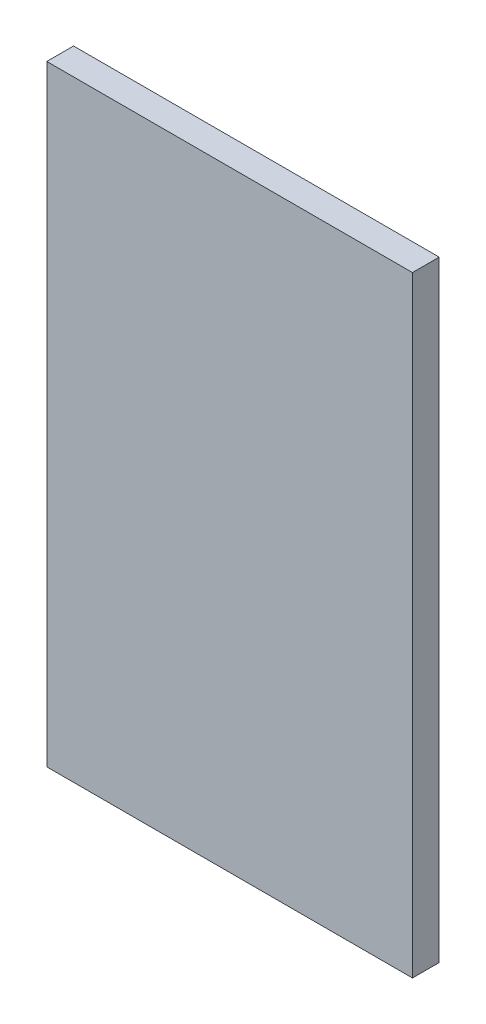
ISO-10303-21;
HEADER;
FILE_DESCRIPTION(('STEP AP214'),'2;1');
FILE_NAME('part.step','',(''),(''),'','','');
FILE_SCHEMA(('AUTOMOTIVE_DESIGN { 1 0 10303 214 1 1 1 1 }'));
ENDSEC;
DATA;
#1=APPLICATION_CONTEXT('core data for automotive mechanical design processes');
#2=APPLICATION_PROTOCOL_DEFINITION('international standard','automotive_design',2000,#1);
#3=PRODUCT_CONTEXT('',#1,'mechanical');
#4=PRODUCT('Part','Part','',(#3));
#5=PRODUCT_RELATED_PRODUCT_CATEGORY('part','',(#4));
#6=PRODUCT_DEFINITION_FORMATION('','',#4);
#7=PRODUCT_DEFINITION_CONTEXT('part definition',#1,'design');
#8=PRODUCT_DEFINITION('design','',#6,#7);
#9=PRODUCT_DEFINITION_SHAPE('','',#8);
#10=(LENGTH_UNIT() NAMED_UNIT(*) SI_UNIT(.MILLI.,.METRE.));
#11=(NAMED_UNIT(*) PLANE_ANGLE_UNIT() SI_UNIT($,.RADIAN.));
#12=(NAMED_UNIT(*) SI_UNIT($,.STERADIAN.) SOLID_ANGLE_UNIT());
#13=UNCERTAINTY_MEASURE_WITH_UNIT(LENGTH_MEASURE(1.E-05),#10,'distance_accuracy_value','');
#14=(GEOMETRIC_REPRESENTATION_CONTEXT(3) GLOBAL_UNCERTAINTY_ASSIGNED_CONTEXT((#13)) GLOBAL_UNIT_ASSIGNED_CONTEXT((#10,
#11,#12)) REPRESENTATION_CONTEXT('',''));
#15=CARTESIAN_POINT('',(0.,0.,0.));
#16=DIRECTION('',(0.,0.,1.));
#17=DIRECTION('',(1.,0.,0.));
#18=AXIS2_PLACEMENT_3D('',#15,#16,#17);
#19=CARTESIAN_POINT('',(583.,204.,12.));
#20=DIRECTION('',(-1.,0.,0.));
#21=DIRECTION('',(0.,0.,1.));
#22=AXIS2_PLACEMENT_3D('',#19,#20,#21);
#23=PLANE('',#22);
#24=DIRECTION('',(0.,1.,0.));
#25=VECTOR('',#24,1.);
#26=CARTESIAN_POINT('',(583.,204.,0.));
#27=LINE('',#26,#25);
#28=CARTESIAN_POINT('',(583.,-70.,0.));
#29=VERTEX_POINT('',#28);
#30=CARTESIAN_POINT('',(583.,204.,0.));
#31=VERTEX_POINT('',#30);
#32=EDGE_CURVE('E95',#29,#31,#27,.T.);
#33=ORIENTED_EDGE('',*,*,#32,.T.);
#34=DIRECTION('',(0.,0.,-1.));
#35=VECTOR('',#34,1.);
#36=CARTESIAN_POINT('',(583.,204.,12.));
#37=LINE('',#36,#35);
#38=CARTESIAN_POINT('',(583.,204.,12.));
#39=VERTEX_POINT('',#38);
#40=EDGE_CURVE('E11',#39,#31,#37,.T.);
#41=ORIENTED_EDGE('',*,*,#40,.F.);
#42=DIRECTION('',(0.,1.,0.));
#43=VECTOR('',#42,1.);
#44=CARTESIAN_POINT('',(583.,204.,12.));
#45=LINE('',#44,#43);
#46=CARTESIAN_POINT('',(583.,-70.,12.));
#47=VERTEX_POINT('',#46);
#48=EDGE_CURVE('E83',#47,#39,#45,.T.);
#49=ORIENTED_EDGE('',*,*,#48,.F.);
#50=DIRECTION('',(0.,0.,-1.));
#51=VECTOR('',#50,1.);
#52=CARTESIAN_POINT('',(583.,-70.,12.));
#53=LINE('',#52,#51);
#54=EDGE_CURVE('E91',#47,#29,#53,.T.);
#55=ORIENTED_EDGE('',*,*,#54,.T.);
#56=EDGE_LOOP('',(#33,#41,#49,#55));
#57=FACE_BOUND('',#56,.T.);
#58=ADVANCED_FACE('F32',(#57),#23,.F.);
#59=CARTESIAN_POINT('',(419.,204.,12.));
#60=DIRECTION('',(0.,-1.,0.));
#61=DIRECTION('',(0.,0.,-1.));
#62=AXIS2_PLACEMENT_3D('',#59,#60,#61);
#63=PLANE('',#62);
#64=DIRECTION('',(-1.,0.,0.));
#65=VECTOR('',#64,1.);
#66=CARTESIAN_POINT('',(419.,204.,0.));
#67=LINE('',#66,#65);
#68=CARTESIAN_POINT('',(419.,204.,0.));
#69=VERTEX_POINT('',#68);
#70=EDGE_CURVE('E87',#31,#69,#67,.T.);
#71=ORIENTED_EDGE('',*,*,#70,.T.);
#72=DIRECTION('',(0.,0.,-1.));
#73=VECTOR('',#72,1.);
#74=CARTESIAN_POINT('',(419.,204.,12.));
#75=LINE('',#74,#73);
#76=CARTESIAN_POINT('',(419.,204.,12.));
#77=VERTEX_POINT('',#76);
#78=EDGE_CURVE('E40',#77,#69,#75,.T.);
#79=ORIENTED_EDGE('',*,*,#78,.F.);
#80=DIRECTION('',(-1.,0.,0.));
#81=VECTOR('',#80,1.);
#82=CARTESIAN_POINT('',(419.,204.,12.));
#83=LINE('',#82,#81);
#84=EDGE_CURVE('E78',#39,#77,#83,.T.);
#85=ORIENTED_EDGE('',*,*,#84,.F.);
#86=ORIENTED_EDGE('',*,*,#40,.T.);
#87=EDGE_LOOP('',(#71,#79,#85,#86));
#88=FACE_BOUND('',#87,.T.);
#89=ADVANCED_FACE('F86',(#88),#63,.F.);
#90=CARTESIAN_POINT('',(419.,204.,12.));
#91=DIRECTION('',(1.,0.,0.));
#92=DIRECTION('',(0.,1.,0.));
#93=AXIS2_PLACEMENT_3D('',#90,#91,#92);
#94=PLANE('',#93);
#95=DIRECTION('',(0.,-1.,0.));
#96=VECTOR('',#95,1.);
#97=CARTESIAN_POINT('',(419.,204.,0.));
#98=LINE('',#97,#96);
#99=CARTESIAN_POINT('',(419.,-70.,0.));
#100=VERTEX_POINT('',#99);
#101=EDGE_CURVE('E65',#69,#100,#98,.T.);
#102=ORIENTED_EDGE('',*,*,#101,.T.);
#103=DIRECTION('',(0.,0.,-1.));
#104=VECTOR('',#103,1.);
#105=CARTESIAN_POINT('',(419.,-70.,12.));
#106=LINE('',#105,#104);
#107=CARTESIAN_POINT('',(419.,-70.,12.));
#108=VERTEX_POINT('',#107);
#109=EDGE_CURVE('E88',#108,#100,#106,.T.);
#110=ORIENTED_EDGE('',*,*,#109,.F.);
#111=DIRECTION('',(0.,-1.,0.));
#112=VECTOR('',#111,1.);
#113=CARTESIAN_POINT('',(419.,204.,12.));
#114=LINE('',#113,#112);
#115=EDGE_CURVE('E81',#77,#108,#114,.T.);
#116=ORIENTED_EDGE('',*,*,#115,.F.);
#117=ORIENTED_EDGE('',*,*,#78,.T.);
#118=EDGE_LOOP('',(#102,#110,#116,#117));
#119=FACE_BOUND('',#118,.T.);
#120=ADVANCED_FACE('F89',(#119),#94,.F.);
#121=CARTESIAN_POINT('',(419.,-70.,12.));
#122=DIRECTION('',(0.,1.,0.));
#123=DIRECTION('',(0.,0.,1.));
#124=AXIS2_PLACEMENT_3D('',#121,#122,#123);
#125=PLANE('',#124);
#126=DIRECTION('',(1.,0.,0.));
#127=VECTOR('',#126,1.);
#128=CARTESIAN_POINT('',(419.,-70.,0.));
#129=LINE('',#128,#127);
#130=EDGE_CURVE('E71',#100,#29,#129,.T.);
#131=ORIENTED_EDGE('',*,*,#130,.T.);
#132=ORIENTED_EDGE('',*,*,#54,.F.);
#133=DIRECTION('',(1.,0.,0.));
#134=VECTOR('',#133,1.);
#135=CARTESIAN_POINT('',(419.,-70.,12.));
#136=LINE('',#135,#134);
#137=EDGE_CURVE('E48',#108,#47,#136,.T.);
#138=ORIENTED_EDGE('',*,*,#137,.F.);
#139=ORIENTED_EDGE('',*,*,#109,.T.);
#140=EDGE_LOOP('',(#131,#132,#138,#139));
#141=FACE_BOUND('',#140,.T.);
#142=ADVANCED_FACE('F102',(#141),#125,.F.);
#143=CARTESIAN_POINT('',(0.,0.,12.));
#144=DIRECTION('',(0.,0.,1.));
#145=DIRECTION('',(1.,0.,0.));
#146=AXIS2_PLACEMENT_3D('',#143,#144,#145);
#147=PLANE('',#146);
#148=ORIENTED_EDGE('',*,*,#48,.T.);
#149=ORIENTED_EDGE('',*,*,#84,.T.);
#150=ORIENTED_EDGE('',*,*,#115,.T.);
#151=ORIENTED_EDGE('',*,*,#137,.T.);
#152=EDGE_LOOP('',(#148,#149,#150,#151));
#153=FACE_BOUND('',#152,.T.);
#154=ADVANCED_FACE('F79',(#153),#147,.T.);
#155=CARTESIAN_POINT('',(0.,0.,0.));
#156=DIRECTION('',(0.,0.,1.));
#157=DIRECTION('',(1.,0.,0.));
#158=AXIS2_PLACEMENT_3D('',#155,#156,#157);
#159=PLANE('',#158);
#160=ORIENTED_EDGE('',*,*,#32,.F.);
#161=ORIENTED_EDGE('',*,*,#130,.F.);
#162=ORIENTED_EDGE('',*,*,#101,.F.);
#163=ORIENTED_EDGE('',*,*,#70,.F.);
#164=EDGE_LOOP('',(#160,#161,#162,#163));
#165=FACE_BOUND('',#164,.T.);
#166=ADVANCED_FACE('F105',(#165),#159,.F.);
#167=CLOSED_SHELL('',(#58,#89,#120,#142,#154,#166));
#168=MANIFOLD_SOLID_BREP('B2',#167);
#169=ADVANCED_BREP_SHAPE_REPRESENTATION('',(#18,#168),#14);
#170=SHAPE_DEFINITION_REPRESENTATION(#9,#169);
ENDSEC;
END-ISO-10303-21;
